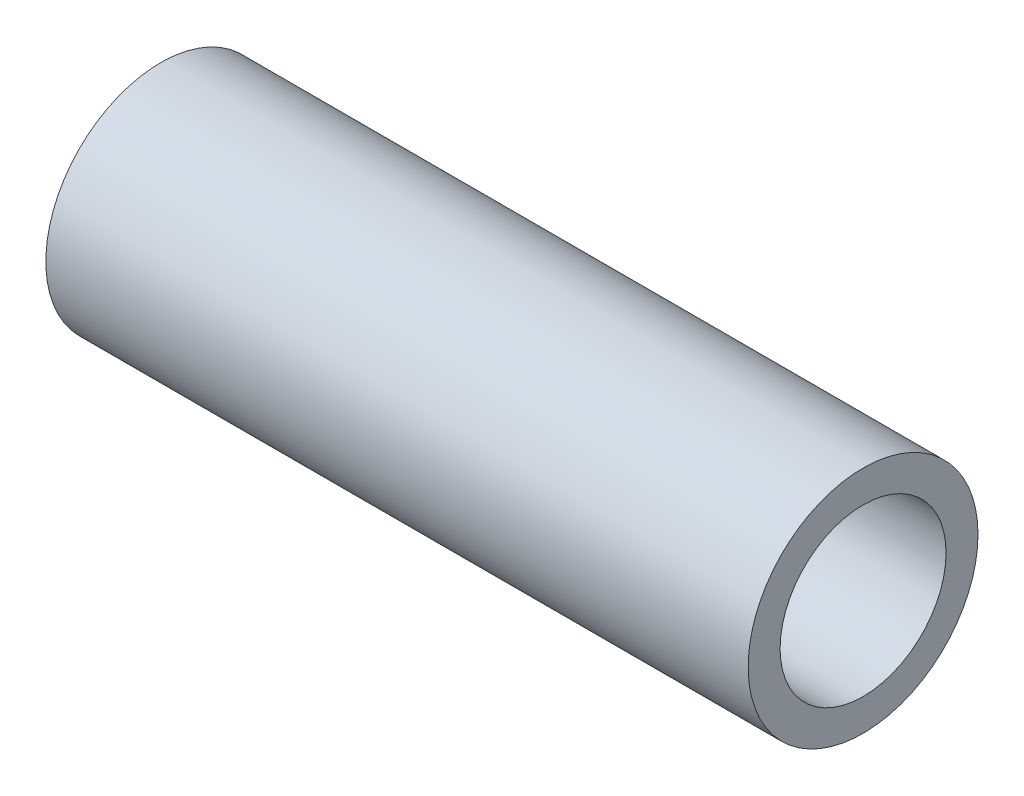
ISO-10303-21;
HEADER;
FILE_DESCRIPTION(('STEP AP214'),'2;1');
FILE_NAME('part.step','',(''),(''),'','','');
FILE_SCHEMA(('AUTOMOTIVE_DESIGN { 1 0 10303 214 1 1 1 1 }'));
ENDSEC;
DATA;
#1=APPLICATION_CONTEXT('core data for automotive mechanical design processes');
#2=APPLICATION_PROTOCOL_DEFINITION('international standard','automotive_design',2000,#1);
#3=PRODUCT_CONTEXT('',#1,'mechanical');
#4=PRODUCT('Part','Part','',(#3));
#5=PRODUCT_RELATED_PRODUCT_CATEGORY('part','',(#4));
#6=PRODUCT_DEFINITION_FORMATION('','',#4);
#7=PRODUCT_DEFINITION_CONTEXT('part definition',#1,'design');
#8=PRODUCT_DEFINITION('design','',#6,#7);
#9=PRODUCT_DEFINITION_SHAPE('','',#8);
#10=(LENGTH_UNIT() NAMED_UNIT(*) SI_UNIT(.MILLI.,.METRE.));
#11=(NAMED_UNIT(*) PLANE_ANGLE_UNIT() SI_UNIT($,.RADIAN.));
#12=(NAMED_UNIT(*) SI_UNIT($,.STERADIAN.) SOLID_ANGLE_UNIT());
#13=UNCERTAINTY_MEASURE_WITH_UNIT(LENGTH_MEASURE(1.E-05),#10,'distance_accuracy_value','');
#14=(GEOMETRIC_REPRESENTATION_CONTEXT(3) GLOBAL_UNCERTAINTY_ASSIGNED_CONTEXT((#13)) GLOBAL_UNIT_ASSIGNED_CONTEXT((#10,
#11,#12)) REPRESENTATION_CONTEXT('',''));
#15=CARTESIAN_POINT('',(0.,0.,0.));
#16=DIRECTION('',(0.,0.,1.));
#17=DIRECTION('',(1.,0.,0.));
#18=AXIS2_PLACEMENT_3D('',#15,#16,#17);
#19=CARTESIAN_POINT('',(27.5,0.,0.));
#20=DIRECTION('',(1.,0.,0.));
#21=DIRECTION('',(0.,0.,-1.));
#22=AXIS2_PLACEMENT_3D('',#19,#20,#21);
#23=PLANE('',#22);
#24=CARTESIAN_POINT('',(27.5,0.,0.));
#25=DIRECTION('',(1.,0.,0.));
#26=DIRECTION('',(0.,0.,-1.));
#27=AXIS2_PLACEMENT_3D('',#24,#25,#26);
#28=CIRCLE('',#27,9.);
#29=CARTESIAN_POINT('',(27.5,0.,-9.));
#30=VERTEX_POINT('',#29);
#31=EDGE_CURVE('E10',#30,#30,#28,.T.);
#32=ORIENTED_EDGE('',*,*,#31,.T.);
#33=EDGE_LOOP('',(#32));
#34=FACE_BOUND('',#33,.T.);
#35=CARTESIAN_POINT('',(27.5,0.,0.));
#36=DIRECTION('',(1.,0.,0.));
#37=DIRECTION('',(0.,0.,-1.));
#38=AXIS2_PLACEMENT_3D('',#35,#36,#37);
#39=CIRCLE('',#38,6.5);
#40=CARTESIAN_POINT('',(27.5,0.,-6.5));
#41=VERTEX_POINT('',#40);
#42=EDGE_CURVE('E48',#41,#41,#39,.T.);
#43=ORIENTED_EDGE('',*,*,#42,.F.);
#44=EDGE_LOOP('',(#43));
#45=FACE_BOUND('',#44,.T.);
#46=ADVANCED_FACE('F37',(#34,#45),#23,.T.);
#47=CARTESIAN_POINT('',(-27.5,0.,0.));
#48=DIRECTION('',(1.,0.,0.));
#49=DIRECTION('',(0.,0.,-1.));
#50=AXIS2_PLACEMENT_3D('',#47,#48,#49);
#51=PLANE('',#50);
#52=CARTESIAN_POINT('',(-27.5,0.,0.));
#53=DIRECTION('',(1.,0.,0.));
#54=DIRECTION('',(0.,0.,-1.));
#55=AXIS2_PLACEMENT_3D('',#52,#53,#54);
#56=CIRCLE('',#55,9.);
#57=CARTESIAN_POINT('',(-27.5,0.,-9.));
#58=VERTEX_POINT('',#57);
#59=EDGE_CURVE('E41',#58,#58,#56,.T.);
#60=ORIENTED_EDGE('',*,*,#59,.F.);
#61=EDGE_LOOP('',(#60));
#62=FACE_BOUND('',#61,.T.);
#63=CARTESIAN_POINT('',(-27.5,0.,0.));
#64=DIRECTION('',(1.,0.,0.));
#65=DIRECTION('',(0.,0.,-1.));
#66=AXIS2_PLACEMENT_3D('',#63,#64,#65);
#67=CIRCLE('',#66,6.5);
#68=CARTESIAN_POINT('',(-27.5,0.,-6.5));
#69=VERTEX_POINT('',#68);
#70=EDGE_CURVE('E50',#69,#69,#67,.T.);
#71=ORIENTED_EDGE('',*,*,#70,.T.);
#72=EDGE_LOOP('',(#71));
#73=FACE_BOUND('',#72,.T.);
#74=ADVANCED_FACE('F60',(#62,#73),#51,.F.);
#75=CARTESIAN_POINT('',(27.5,0.,0.));
#76=DIRECTION('',(-1.,0.,0.));
#77=DIRECTION('',(0.,0.,1.));
#78=AXIS2_PLACEMENT_3D('',#75,#76,#77);
#79=CYLINDRICAL_SURFACE('',#78,9.);
#80=ORIENTED_EDGE('',*,*,#31,.F.);
#81=EDGE_LOOP('',(#80));
#82=FACE_BOUND('',#81,.T.);
#83=ORIENTED_EDGE('',*,*,#59,.T.);
#84=EDGE_LOOP('',(#83));
#85=FACE_BOUND('',#84,.T.);
#86=ADVANCED_FACE('F39',(#82,#85),#79,.T.);
#87=CARTESIAN_POINT('',(27.5,0.,0.));
#88=DIRECTION('',(-1.,0.,0.));
#89=DIRECTION('',(0.,0.,1.));
#90=AXIS2_PLACEMENT_3D('',#87,#88,#89);
#91=CYLINDRICAL_SURFACE('',#90,6.5);
#92=ORIENTED_EDGE('',*,*,#42,.T.);
#93=EDGE_LOOP('',(#92));
#94=FACE_BOUND('',#93,.T.);
#95=ORIENTED_EDGE('',*,*,#70,.F.);
#96=EDGE_LOOP('',(#95));
#97=FACE_BOUND('',#96,.T.);
#98=ADVANCED_FACE('F56',(#94,#97),#91,.F.);
#99=CLOSED_SHELL('',(#46,#74,#86,#98));
#100=MANIFOLD_SOLID_BREP('B2',#99);
#101=ADVANCED_BREP_SHAPE_REPRESENTATION('',(#18,#100),#14);
#102=SHAPE_DEFINITION_REPRESENTATION(#9,#101);
ENDSEC;
END-ISO-10303-21;
